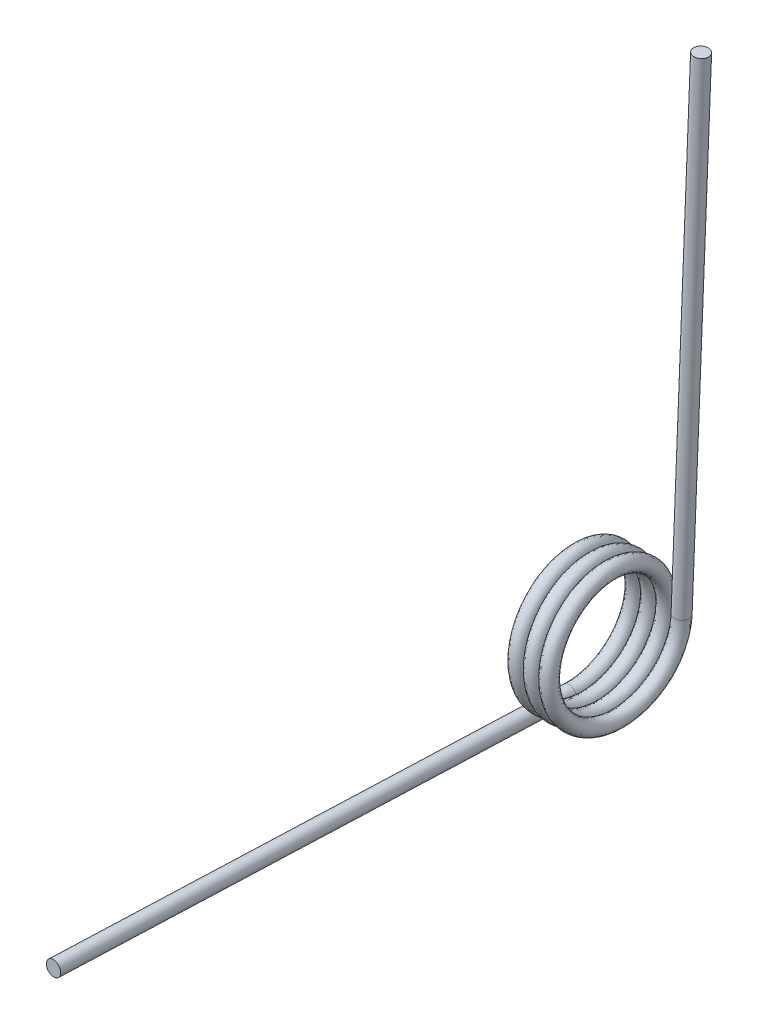
ISO-10303-21;
HEADER;
FILE_DESCRIPTION(('STEP AP214'),'2;1');
FILE_NAME('part.step','',(''),(''),'','','');
FILE_SCHEMA(('AUTOMOTIVE_DESIGN { 1 0 10303 214 1 1 1 1 }'));
ENDSEC;
DATA;
#1=APPLICATION_CONTEXT('core data for automotive mechanical design processes');
#2=APPLICATION_PROTOCOL_DEFINITION('international standard','automotive_design',2000,#1);
#3=PRODUCT_CONTEXT('',#1,'mechanical');
#4=PRODUCT('Part','Part','',(#3));
#5=PRODUCT_RELATED_PRODUCT_CATEGORY('part','',(#4));
#6=PRODUCT_DEFINITION_FORMATION('','',#4);
#7=PRODUCT_DEFINITION_CONTEXT('part definition',#1,'design');
#8=PRODUCT_DEFINITION('design','',#6,#7);
#9=PRODUCT_DEFINITION_SHAPE('','',#8);
#10=(LENGTH_UNIT() NAMED_UNIT(*) SI_UNIT(.MILLI.,.METRE.));
#11=(NAMED_UNIT(*) PLANE_ANGLE_UNIT() SI_UNIT($,.RADIAN.));
#12=(NAMED_UNIT(*) SI_UNIT($,.STERADIAN.) SOLID_ANGLE_UNIT());
#13=UNCERTAINTY_MEASURE_WITH_UNIT(LENGTH_MEASURE(1.E-05),#10,'distance_accuracy_value','');
#14=(GEOMETRIC_REPRESENTATION_CONTEXT(3) GLOBAL_UNCERTAINTY_ASSIGNED_CONTEXT((#13)) GLOBAL_UNIT_ASSIGNED_CONTEXT((#10,
#11,#12)) REPRESENTATION_CONTEXT('',''));
#15=CARTESIAN_POINT('',(0.,0.,0.));
#16=DIRECTION('',(0.,0.,1.));
#17=DIRECTION('',(1.,0.,0.));
#18=AXIS2_PLACEMENT_3D('',#15,#16,#17);
#19=CARTESIAN_POINT('',(-0.380705918215079,-3.1877,-0.0149667576988089));
#20=CARTESIAN_POINT('',(-0.315089251548412,-3.1790589384137,-1.85538621079458));
#21=CARTESIAN_POINT('',(-0.249472584881746,-1.58088840762055,-2.76811255849306));
#22=CARTESIAN_POINT('',(-0.183855918215079,0.0172821231726062,-3.68083890619154));
#23=CARTESIAN_POINT('',(-0.118239251548413,1.60681159237945,-2.75314580079425));
#24=CARTESIAN_POINT('',(-0.0526225848817462,3.1963410615863,-1.82545269539696));
#25=CARTESIAN_POINT('',(0.0129940817849203,3.1877,0.0149667576988085));
#26=CARTESIAN_POINT('',(0.0786107484515868,3.1790589384137,1.85538621079458));
#27=CARTESIAN_POINT('',(0.144227415118253,1.58088840762055,2.76811255849306));
#28=CARTESIAN_POINT('',(0.20984408178492,-0.0172821231726057,3.68083890619154));
#29=CARTESIAN_POINT('',(0.275460748451586,-1.60681159237945,2.75314580079425));
#30=CARTESIAN_POINT('',(0.341077415118253,-3.1963410615863,1.82545269539696));
#31=CARTESIAN_POINT('',(0.406694081784919,-3.1877,-0.0149667576988089));
#32=CARTESIAN_POINT('',(0.472310748451586,-3.1790589384137,-1.85538621079458));
#33=CARTESIAN_POINT('',(0.537927415118252,-1.58088840762055,-2.76811255849306));
#34=CARTESIAN_POINT('',(0.603544081784919,0.0172821231726062,-3.68083890619154));
#35=CARTESIAN_POINT('',(0.669160748451586,1.60681159237945,-2.75314580079425));
#36=CARTESIAN_POINT('',(0.734777415118252,3.1963410615863,-1.82545269539696));
#37=CARTESIAN_POINT('',(0.800394081784919,3.1877,0.0149667576988085));
#38=CARTESIAN_POINT('',(0.866010748451585,3.1790589384137,1.85538621079458));
#39=CARTESIAN_POINT('',(0.931627415118252,1.58088840762055,2.76811255849306));
#40=CARTESIAN_POINT('',(0.997244081784918,-0.0172821231726057,3.68083890619154));
#41=CARTESIAN_POINT('',(1.06286074845158,-1.60681159237945,2.75314580079425));
#42=CARTESIAN_POINT('',(1.12847741511825,-3.1963410615863,1.82545269539696));
#43=CARTESIAN_POINT('',(1.19409408178492,-3.1877,-0.0149667576988089));
#44=CARTESIAN_POINT('',(1.25971074845158,-3.1790589384137,-1.85538621079458));
#45=CARTESIAN_POINT('',(1.32532741511825,-1.58088840762055,-2.76811255849306));
#46=CARTESIAN_POINT('',(1.39094408178492,0.0172821231726062,-3.68083890619154));
#47=CARTESIAN_POINT('',(1.45656074845158,1.60681159237945,-2.75314580079425));
#48=CARTESIAN_POINT('',(1.52217741511825,3.1963410615863,-1.82545269539696));
#49=CARTESIAN_POINT('',(1.58779408178492,3.1877,0.0149667576988085));
#50=CARTESIAN_POINT('',(1.65341074845158,3.1790589384137,1.85538621079458));
#51=CARTESIAN_POINT('',(1.71902741511825,1.58088840762055,2.76811255849306));
#52=CARTESIAN_POINT('',(1.78464408178492,-0.0172821231726057,3.68083890619154));
#53=CARTESIAN_POINT('',(1.85026074845158,-1.60681159237945,2.75314580079425));
#54=CARTESIAN_POINT('',(1.91587741511825,-3.1963410615863,1.82545269539696));
#55=CARTESIAN_POINT('',(1.98149408178492,-3.1877,-0.0149667576988089));
#56=CARTESIAN_POINT('',(2.04711074845158,-3.1790589384137,-1.85538621079458));
#57=CARTESIAN_POINT('',(2.11272741511825,-1.58088840762055,-2.76811255849306));
#58=CARTESIAN_POINT('',(2.17834408178492,0.0172821231726062,-3.68083890619154));
#59=CARTESIAN_POINT('',(2.24396074845158,1.60681159237945,-2.75314580079425));
#60=CARTESIAN_POINT('',(2.30957741511825,3.1963410615863,-1.82545269539696));
#61=CARTESIAN_POINT('',(2.37519408178491,3.1877,0.0149667576988085));
#62=CARTESIAN_POINT('',(2.44081074845158,3.1790589384137,1.85538621079458));
#63=CARTESIAN_POINT('',(2.50642741511825,1.58088840762055,2.76811255849306));
#64=CARTESIAN_POINT('',(2.57204408178491,-0.0172821231726057,3.68083890619154));
#65=CARTESIAN_POINT('',(2.63766074845158,-1.60681159237945,2.75314580079425));
#66=CARTESIAN_POINT('',(2.70327741511825,-3.1963410615863,1.82545269539696));
#67=CARTESIAN_POINT('',(2.76889408178491,-3.1877,-0.0149667576988089));
#68=CARTESIAN_POINT('',(-0.380705918215079,-2.4257,-0.0149667576988011));
#69=CARTESIAN_POINT('',(-0.315089251548413,-2.4170589384137,-1.41544530567208));
#70=CARTESIAN_POINT('',(-0.249472584881746,-1.19988840762055,-2.10820120080931));
#71=CARTESIAN_POINT('',(-0.18385591821508,0.0172821231725972,-2.80095709594655));
#72=CARTESIAN_POINT('',(-0.118239251548413,1.22581159237945,-2.09323444311051));
#73=CARTESIAN_POINT('',(-0.0526225848817465,2.4343410615863,-1.38551179027448));
#74=CARTESIAN_POINT('',(0.01299408178492,2.4257,0.0149667576988008));
#75=CARTESIAN_POINT('',(0.0786107484515865,2.4170589384137,1.41544530567208));
#76=CARTESIAN_POINT('',(0.144227415118253,1.19988840762055,2.10820120080931));
#77=CARTESIAN_POINT('',(0.20984408178492,-0.0172821231725969,2.80095709594655));
#78=CARTESIAN_POINT('',(0.275460748451586,-1.22581159237945,2.09323444311051));
#79=CARTESIAN_POINT('',(0.341077415118253,-2.4343410615863,1.38551179027448));
#80=CARTESIAN_POINT('',(0.406694081784919,-2.4257,-0.0149667576988011));
#81=CARTESIAN_POINT('',(0.472310748451586,-2.4170589384137,-1.41544530567208));
#82=CARTESIAN_POINT('',(0.537927415118252,-1.19988840762055,-2.10820120080931));
#83=CARTESIAN_POINT('',(0.603544081784919,0.0172821231725972,-2.80095709594655));
#84=CARTESIAN_POINT('',(0.669160748451585,1.22581159237945,-2.09323444311051));
#85=CARTESIAN_POINT('',(0.734777415118252,2.4343410615863,-1.38551179027448));
#86=CARTESIAN_POINT('',(0.800394081784918,2.4257,0.0149667576988008));
#87=CARTESIAN_POINT('',(0.866010748451585,2.4170589384137,1.41544530567208));
#88=CARTESIAN_POINT('',(0.931627415118251,1.19988840762055,2.10820120080931));
#89=CARTESIAN_POINT('',(0.997244081784918,-0.0172821231725969,2.80095709594655));
#90=CARTESIAN_POINT('',(1.06286074845158,-1.22581159237945,2.09323444311051));
#91=CARTESIAN_POINT('',(1.12847741511825,-2.4343410615863,1.38551179027448));
#92=CARTESIAN_POINT('',(1.19409408178492,-2.4257,-0.0149667576988011));
#93=CARTESIAN_POINT('',(1.25971074845158,-2.4170589384137,-1.41544530567208));
#94=CARTESIAN_POINT('',(1.32532741511825,-1.19988840762055,-2.10820120080931));
#95=CARTESIAN_POINT('',(1.39094408178492,0.0172821231725972,-2.80095709594655));
#96=CARTESIAN_POINT('',(1.45656074845158,1.22581159237945,-2.09323444311051));
#97=CARTESIAN_POINT('',(1.52217741511825,2.4343410615863,-1.38551179027448));
#98=CARTESIAN_POINT('',(1.58779408178492,2.4257,0.0149667576988008));
#99=CARTESIAN_POINT('',(1.65341074845158,2.4170589384137,1.41544530567208));
#100=CARTESIAN_POINT('',(1.71902741511825,1.19988840762055,2.10820120080931));
#101=CARTESIAN_POINT('',(1.78464408178492,-0.0172821231725969,2.80095709594655));
#102=CARTESIAN_POINT('',(1.85026074845158,-1.22581159237945,2.09323444311051));
#103=CARTESIAN_POINT('',(1.91587741511825,-2.4343410615863,1.38551179027448));
#104=CARTESIAN_POINT('',(1.98149408178492,-2.4257,-0.0149667576988011));
#105=CARTESIAN_POINT('',(2.04711074845158,-2.4170589384137,-1.41544530567208));
#106=CARTESIAN_POINT('',(2.11272741511825,-1.19988840762055,-2.10820120080931));
#107=CARTESIAN_POINT('',(2.17834408178492,0.0172821231725972,-2.80095709594655));
#108=CARTESIAN_POINT('',(2.24396074845158,1.22581159237945,-2.09323444311051));
#109=CARTESIAN_POINT('',(2.30957741511825,2.4343410615863,-1.38551179027448));
#110=CARTESIAN_POINT('',(2.37519408178491,2.4257,0.0149667576988008));
#111=CARTESIAN_POINT('',(2.44081074845158,2.4170589384137,1.41544530567208));
#112=CARTESIAN_POINT('',(2.50642741511825,1.19988840762055,2.10820120080931));
#113=CARTESIAN_POINT('',(2.57204408178491,-0.0172821231725969,2.80095709594655));
#114=CARTESIAN_POINT('',(2.63766074845158,-1.22581159237945,2.09323444311051));
#115=CARTESIAN_POINT('',(2.70327741511825,-2.4343410615863,1.38551179027448));
#116=CARTESIAN_POINT('',(2.76889408178491,-2.4257,-0.0149667576988011));
#117=CARTESIAN_POINT('',(0.380705918215078,-2.4257,0.0149667576987499));
#118=CARTESIAN_POINT('',(0.446322584881745,-2.43434106158627,-1.38551179027453));
#119=CARTESIAN_POINT('',(0.511939251548411,-1.2258115923794,-2.09323444311054));
#120=CARTESIAN_POINT('',(0.577555918215078,-0.0172821231725385,-2.80095709594655));
#121=CARTESIAN_POINT('',(0.643172584881745,1.1998884076206,-2.10820120080929));
#122=CARTESIAN_POINT('',(0.708789251548411,2.41705893841373,-1.41544530567203));
#123=CARTESIAN_POINT('',(0.774405918215077,2.4257,-0.0149667576987502));
#124=CARTESIAN_POINT('',(0.840022584881744,2.43434106158627,1.38551179027453));
#125=CARTESIAN_POINT('',(0.905639251548411,1.22581159237941,2.09323444311054));
#126=CARTESIAN_POINT('',(0.971255918215077,0.0172821231725388,2.80095709594655));
#127=CARTESIAN_POINT('',(1.03687258488174,-1.1998884076206,2.10820120080929));
#128=CARTESIAN_POINT('',(1.10248925154841,-2.41705893841373,1.41544530567203));
#129=CARTESIAN_POINT('',(1.16810591821508,-2.4257,0.0149667576987499));
#130=CARTESIAN_POINT('',(1.23372258488174,-2.43434106158627,-1.38551179027453));
#131=CARTESIAN_POINT('',(1.29933925154841,-1.2258115923794,-2.09323444311054));
#132=CARTESIAN_POINT('',(1.36495591821508,-0.0172821231725385,-2.80095709594655));
#133=CARTESIAN_POINT('',(1.43057258488174,1.1998884076206,-2.10820120080929));
#134=CARTESIAN_POINT('',(1.49618925154841,2.41705893841373,-1.41544530567203));
#135=CARTESIAN_POINT('',(1.56180591821508,2.4257,-0.0149667576987502));
#136=CARTESIAN_POINT('',(1.62742258488174,2.43434106158627,1.38551179027453));
#137=CARTESIAN_POINT('',(1.69303925154841,1.22581159237941,2.09323444311054));
#138=CARTESIAN_POINT('',(1.75865591821508,0.0172821231725388,2.80095709594655));
#139=CARTESIAN_POINT('',(1.82427258488174,-1.1998884076206,2.10820120080929));
#140=CARTESIAN_POINT('',(1.88988925154841,-2.41705893841373,1.41544530567203));
#141=CARTESIAN_POINT('',(1.95550591821507,-2.4257,0.0149667576987499));
#142=CARTESIAN_POINT('',(2.02112258488174,-2.43434106158627,-1.38551179027453));
#143=CARTESIAN_POINT('',(2.08673925154841,-1.2258115923794,-2.09323444311054));
#144=CARTESIAN_POINT('',(2.15235591821507,-0.0172821231725385,-2.80095709594655));
#145=CARTESIAN_POINT('',(2.21797258488174,1.1998884076206,-2.10820120080929));
#146=CARTESIAN_POINT('',(2.28358925154841,2.41705893841373,-1.41544530567203));
#147=CARTESIAN_POINT('',(2.34920591821507,2.4257,-0.0149667576987502));
#148=CARTESIAN_POINT('',(2.41482258488174,2.43434106158627,1.38551179027453));
#149=CARTESIAN_POINT('',(2.48043925154841,1.22581159237941,2.09323444311054));
#150=CARTESIAN_POINT('',(2.54605591821507,0.0172821231725388,2.80095709594655));
#151=CARTESIAN_POINT('',(2.61167258488174,-1.1998884076206,2.10820120080929));
#152=CARTESIAN_POINT('',(2.67728925154841,-2.41705893841373,1.41544530567203));
#153=CARTESIAN_POINT('',(2.74290591821507,-2.4257,0.0149667576987499));
#154=CARTESIAN_POINT('',(2.80852258488174,-2.43434106158627,-1.38551179027453));
#155=CARTESIAN_POINT('',(2.87413925154841,-1.2258115923794,-2.09323444311054));
#156=CARTESIAN_POINT('',(2.93975591821507,-0.0172821231725385,-2.80095709594655));
#157=CARTESIAN_POINT('',(3.00537258488174,1.1998884076206,-2.10820120080929));
#158=CARTESIAN_POINT('',(3.07098925154841,2.41705893841373,-1.41544530567203));
#159=CARTESIAN_POINT('',(3.13660591821507,2.4257,-0.0149667576987502));
#160=CARTESIAN_POINT('',(3.20222258488174,2.43434106158627,1.38551179027453));
#161=CARTESIAN_POINT('',(3.26783925154841,1.22581159237941,2.09323444311054));
#162=CARTESIAN_POINT('',(3.33345591821507,0.0172821231725388,2.80095709594655));
#163=CARTESIAN_POINT('',(3.39907258488174,-1.1998884076206,2.10820120080929));
#164=CARTESIAN_POINT('',(3.46468925154841,-2.41705893841373,1.41544530567203));
#165=CARTESIAN_POINT('',(3.53030591821507,-2.4257,0.0149667576987499));
#166=CARTESIAN_POINT('',(0.380705918215079,-3.1877,0.0149667576987421));
#167=CARTESIAN_POINT('',(0.446322584881745,-3.19634106158626,-1.82545269539703));
#168=CARTESIAN_POINT('',(0.511939251548412,-1.6068115923794,-2.75314580079428));
#169=CARTESIAN_POINT('',(0.577555918215078,-0.0172821231725295,-3.68083890619154));
#170=CARTESIAN_POINT('',(0.643172584881745,1.5808884076206,-2.76811255849303));
#171=CARTESIAN_POINT('',(0.708789251548412,3.17905893841374,-1.85538621079451));
#172=CARTESIAN_POINT('',(0.774405918215078,3.1877,-0.0149667576987425));
#173=CARTESIAN_POINT('',(0.840022584881744,3.19634106158626,1.82545269539703));
#174=CARTESIAN_POINT('',(0.905639251548411,1.6068115923794,2.75314580079428));
#175=CARTESIAN_POINT('',(0.971255918215078,0.01728212317253,3.68083890619154));
#176=CARTESIAN_POINT('',(1.03687258488174,-1.5808884076206,2.76811255849303));
#177=CARTESIAN_POINT('',(1.10248925154841,-3.17905893841374,1.85538621079451));
#178=CARTESIAN_POINT('',(1.16810591821508,-3.1877,0.0149667576987421));
#179=CARTESIAN_POINT('',(1.23372258488174,-3.19634106158626,-1.82545269539703));
#180=CARTESIAN_POINT('',(1.29933925154841,-1.6068115923794,-2.75314580079428));
#181=CARTESIAN_POINT('',(1.36495591821508,-0.0172821231725295,-3.68083890619154));
#182=CARTESIAN_POINT('',(1.43057258488174,1.5808884076206,-2.76811255849303));
#183=CARTESIAN_POINT('',(1.49618925154841,3.17905893841374,-1.85538621079451));
#184=CARTESIAN_POINT('',(1.56180591821508,3.1877,-0.0149667576987425));
#185=CARTESIAN_POINT('',(1.62742258488174,3.19634106158626,1.82545269539703));
#186=CARTESIAN_POINT('',(1.69303925154841,1.6068115923794,2.75314580079428));
#187=CARTESIAN_POINT('',(1.75865591821508,0.01728212317253,3.68083890619154));
#188=CARTESIAN_POINT('',(1.82427258488174,-1.5808884076206,2.76811255849303));
#189=CARTESIAN_POINT('',(1.88988925154841,-3.17905893841374,1.85538621079451));
#190=CARTESIAN_POINT('',(1.95550591821508,-3.1877,0.0149667576987421));
#191=CARTESIAN_POINT('',(2.02112258488174,-3.19634106158626,-1.82545269539703));
#192=CARTESIAN_POINT('',(2.08673925154841,-1.6068115923794,-2.75314580079428));
#193=CARTESIAN_POINT('',(2.15235591821508,-0.0172821231725295,-3.68083890619154));
#194=CARTESIAN_POINT('',(2.21797258488174,1.5808884076206,-2.76811255849303));
#195=CARTESIAN_POINT('',(2.28358925154841,3.17905893841374,-1.85538621079451));
#196=CARTESIAN_POINT('',(2.34920591821507,3.1877,-0.0149667576987425));
#197=CARTESIAN_POINT('',(2.41482258488174,3.19634106158626,1.82545269539703));
#198=CARTESIAN_POINT('',(2.48043925154841,1.6068115923794,2.75314580079428));
#199=CARTESIAN_POINT('',(2.54605591821507,0.01728212317253,3.68083890619154));
#200=CARTESIAN_POINT('',(2.61167258488174,-1.5808884076206,2.76811255849303));
#201=CARTESIAN_POINT('',(2.67728925154841,-3.17905893841374,1.85538621079451));
#202=CARTESIAN_POINT('',(2.74290591821507,-3.1877,0.0149667576987421));
#203=CARTESIAN_POINT('',(2.80852258488174,-3.19634106158626,-1.82545269539703));
#204=CARTESIAN_POINT('',(2.87413925154841,-1.6068115923794,-2.75314580079428));
#205=CARTESIAN_POINT('',(2.93975591821507,-0.0172821231725295,-3.68083890619154));
#206=CARTESIAN_POINT('',(3.00537258488174,1.5808884076206,-2.76811255849303));
#207=CARTESIAN_POINT('',(3.07098925154841,3.17905893841374,-1.85538621079451));
#208=CARTESIAN_POINT('',(3.13660591821507,3.1877,-0.0149667576987425));
#209=CARTESIAN_POINT('',(3.20222258488174,3.19634106158626,1.82545269539703));
#210=CARTESIAN_POINT('',(3.26783925154841,1.6068115923794,2.75314580079428));
#211=CARTESIAN_POINT('',(3.33345591821507,0.01728212317253,3.68083890619154));
#212=CARTESIAN_POINT('',(3.39907258488174,-1.5808884076206,2.76811255849303));
#213=CARTESIAN_POINT('',(3.46468925154841,-3.17905893841374,1.85538621079451));
#214=CARTESIAN_POINT('',(3.53030591821507,-3.1877,0.0149667576987421));
#215=CARTESIAN_POINT('',(0.380705918215079,-3.9497,0.0149667576987343));
#216=CARTESIAN_POINT('',(0.446322584881746,-3.95834106158626,-2.26539360051953));
#217=CARTESIAN_POINT('',(0.511939251548412,-1.98781159237939,-3.41305715847803));
#218=CARTESIAN_POINT('',(0.577555918215079,-0.0172821231725206,-4.56072071643653));
#219=CARTESIAN_POINT('',(0.643172584881745,1.96188840762061,-3.42802391617677));
#220=CARTESIAN_POINT('',(0.708789251548412,3.94105893841374,-2.295327115917));
#221=CARTESIAN_POINT('',(0.774405918215078,3.9497,-0.0149667576987348));
#222=CARTESIAN_POINT('',(0.840022584881745,3.95834106158626,2.26539360051953));
#223=CARTESIAN_POINT('',(0.905639251548411,1.98781159237939,3.41305715847803));
#224=CARTESIAN_POINT('',(0.971255918215078,0.0172821231725211,4.56072071643653));
#225=CARTESIAN_POINT('',(1.03687258488174,-1.96188840762061,3.42802391617677));
#226=CARTESIAN_POINT('',(1.10248925154841,-3.94105893841374,2.295327115917));
#227=CARTESIAN_POINT('',(1.16810591821508,-3.9497,0.0149667576987343));
#228=CARTESIAN_POINT('',(1.23372258488174,-3.95834106158626,-2.26539360051953));
#229=CARTESIAN_POINT('',(1.29933925154841,-1.98781159237939,-3.41305715847803));
#230=CARTESIAN_POINT('',(1.36495591821508,-0.0172821231725206,-4.56072071643653));
#231=CARTESIAN_POINT('',(1.43057258488174,1.96188840762061,-3.42802391617677));
#232=CARTESIAN_POINT('',(1.49618925154841,3.94105893841374,-2.295327115917));
#233=CARTESIAN_POINT('',(1.56180591821508,3.9497,-0.0149667576987348));
#234=CARTESIAN_POINT('',(1.62742258488174,3.95834106158626,2.26539360051953));
#235=CARTESIAN_POINT('',(1.69303925154841,1.98781159237939,3.41305715847803));
#236=CARTESIAN_POINT('',(1.75865591821508,0.0172821231725211,4.56072071643653));
#237=CARTESIAN_POINT('',(1.82427258488174,-1.96188840762061,3.42802391617677));
#238=CARTESIAN_POINT('',(1.88988925154841,-3.94105893841374,2.295327115917));
#239=CARTESIAN_POINT('',(1.95550591821508,-3.9497,0.0149667576987343));
#240=CARTESIAN_POINT('',(2.02112258488174,-3.95834106158626,-2.26539360051953));
#241=CARTESIAN_POINT('',(2.08673925154841,-1.98781159237939,-3.41305715847803));
#242=CARTESIAN_POINT('',(2.15235591821508,-0.0172821231725206,-4.56072071643653));
#243=CARTESIAN_POINT('',(2.21797258488174,1.96188840762061,-3.42802391617677));
#244=CARTESIAN_POINT('',(2.28358925154841,3.94105893841374,-2.295327115917));
#245=CARTESIAN_POINT('',(2.34920591821508,3.9497,-0.0149667576987348));
#246=CARTESIAN_POINT('',(2.41482258488174,3.95834106158626,2.26539360051953));
#247=CARTESIAN_POINT('',(2.48043925154841,1.98781159237939,3.41305715847803));
#248=CARTESIAN_POINT('',(2.54605591821508,0.0172821231725211,4.56072071643653));
#249=CARTESIAN_POINT('',(2.61167258488174,-1.96188840762061,3.42802391617677));
#250=CARTESIAN_POINT('',(2.67728925154841,-3.94105893841374,2.295327115917));
#251=CARTESIAN_POINT('',(2.74290591821507,-3.9497,0.0149667576987343));
#252=CARTESIAN_POINT('',(2.80852258488174,-3.95834106158626,-2.26539360051953));
#253=CARTESIAN_POINT('',(2.87413925154841,-1.98781159237939,-3.41305715847803));
#254=CARTESIAN_POINT('',(2.93975591821507,-0.0172821231725206,-4.56072071643653));
#255=CARTESIAN_POINT('',(3.00537258488174,1.96188840762061,-3.42802391617677));
#256=CARTESIAN_POINT('',(3.07098925154841,3.94105893841374,-2.295327115917));
#257=CARTESIAN_POINT('',(3.13660591821507,3.9497,-0.0149667576987348));
#258=CARTESIAN_POINT('',(3.20222258488174,3.95834106158626,2.26539360051953));
#259=CARTESIAN_POINT('',(3.26783925154841,1.98781159237939,3.41305715847803));
#260=CARTESIAN_POINT('',(3.33345591821507,0.0172821231725211,4.56072071643653));
#261=CARTESIAN_POINT('',(3.39907258488174,-1.96188840762061,3.42802391617677));
#262=CARTESIAN_POINT('',(3.46468925154841,-3.94105893841374,2.295327115917));
#263=CARTESIAN_POINT('',(3.53030591821507,-3.9497,0.0149667576987343));
#264=CARTESIAN_POINT('',(-0.380705918215079,-3.9497,-0.0149667576988167));
#265=CARTESIAN_POINT('',(-0.315089251548412,-3.94105893841369,-2.29532711591708));
#266=CARTESIAN_POINT('',(-0.249472584881745,-1.96188840762054,-3.42802391617681));
#267=CARTESIAN_POINT('',(-0.183855918215079,0.0172821231726151,-4.56072071643653));
#268=CARTESIAN_POINT('',(-0.118239251548412,1.98781159237946,-3.41305715847799));
#269=CARTESIAN_POINT('',(-0.0526225848817458,3.95834106158631,-2.26539360051945));
#270=CARTESIAN_POINT('',(0.0129940817849206,3.9497,0.0149667576988162));
#271=CARTESIAN_POINT('',(0.0786107484515872,3.94105893841369,2.29532711591708));
#272=CARTESIAN_POINT('',(0.144227415118254,1.96188840762054,3.42802391617681));
#273=CARTESIAN_POINT('',(0.20984408178492,-0.0172821231726146,4.56072071643653));
#274=CARTESIAN_POINT('',(0.275460748451587,-1.98781159237946,3.41305715847799));
#275=CARTESIAN_POINT('',(0.341077415118253,-3.95834106158631,2.26539360051945));
#276=CARTESIAN_POINT('',(0.40669408178492,-3.9497,-0.0149667576988167));
#277=CARTESIAN_POINT('',(0.472310748451586,-3.94105893841369,-2.29532711591708));
#278=CARTESIAN_POINT('',(0.537927415118253,-1.96188840762054,-3.42802391617681));
#279=CARTESIAN_POINT('',(0.603544081784919,0.0172821231726151,-4.56072071643653));
#280=CARTESIAN_POINT('',(0.669160748451586,1.98781159237946,-3.41305715847799));
#281=CARTESIAN_POINT('',(0.734777415118252,3.95834106158631,-2.26539360051945));
#282=CARTESIAN_POINT('',(0.800394081784919,3.9497,0.0149667576988162));
#283=CARTESIAN_POINT('',(0.866010748451585,3.94105893841369,2.29532711591708));
#284=CARTESIAN_POINT('',(0.931627415118252,1.96188840762054,3.42802391617681));
#285=CARTESIAN_POINT('',(0.997244081784919,-0.0172821231726146,4.56072071643653));
#286=CARTESIAN_POINT('',(1.06286074845159,-1.98781159237946,3.41305715847799));
#287=CARTESIAN_POINT('',(1.12847741511825,-3.95834106158631,2.26539360051945));
#288=CARTESIAN_POINT('',(1.19409408178492,-3.9497,-0.0149667576988167));
#289=CARTESIAN_POINT('',(1.25971074845158,-3.94105893841369,-2.29532711591708));
#290=CARTESIAN_POINT('',(1.32532741511825,-1.96188840762054,-3.42802391617681));
#291=CARTESIAN_POINT('',(1.39094408178492,0.0172821231726151,-4.56072071643653));
#292=CARTESIAN_POINT('',(1.45656074845158,1.98781159237946,-3.41305715847799));
#293=CARTESIAN_POINT('',(1.52217741511825,3.95834106158631,-2.26539360051945));
#294=CARTESIAN_POINT('',(1.58779408178492,3.9497,0.0149667576988162));
#295=CARTESIAN_POINT('',(1.65341074845158,3.94105893841369,2.29532711591708));
#296=CARTESIAN_POINT('',(1.71902741511825,1.96188840762054,3.42802391617681));
#297=CARTESIAN_POINT('',(1.78464408178492,-0.0172821231726146,4.56072071643653));
#298=CARTESIAN_POINT('',(1.85026074845158,-1.98781159237946,3.41305715847799));
#299=CARTESIAN_POINT('',(1.91587741511825,-3.95834106158631,2.26539360051945));
#300=CARTESIAN_POINT('',(1.98149408178492,-3.9497,-0.0149667576988167));
#301=CARTESIAN_POINT('',(2.04711074845158,-3.94105893841369,-2.29532711591708));
#302=CARTESIAN_POINT('',(2.11272741511825,-1.96188840762054,-3.42802391617681));
#303=CARTESIAN_POINT('',(2.17834408178492,0.0172821231726151,-4.56072071643653));
#304=CARTESIAN_POINT('',(2.24396074845158,1.98781159237946,-3.41305715847799));
#305=CARTESIAN_POINT('',(2.30957741511825,3.95834106158631,-2.26539360051945));
#306=CARTESIAN_POINT('',(2.37519408178492,3.9497,0.0149667576988162));
#307=CARTESIAN_POINT('',(2.44081074845158,3.94105893841369,2.29532711591708));
#308=CARTESIAN_POINT('',(2.50642741511825,1.96188840762054,3.42802391617681));
#309=CARTESIAN_POINT('',(2.57204408178492,-0.0172821231726146,4.56072071643653));
#310=CARTESIAN_POINT('',(2.63766074845158,-1.98781159237946,3.41305715847799));
#311=CARTESIAN_POINT('',(2.70327741511825,-3.95834106158631,2.26539360051945));
#312=CARTESIAN_POINT('',(2.76889408178491,-3.9497,-0.0149667576988167));
#313=CARTESIAN_POINT('',(-0.380705918215079,-3.1877,-0.0149667576988089));
#314=CARTESIAN_POINT('',(-0.315089251548412,-3.1790589384137,-1.85538621079458));
#315=CARTESIAN_POINT('',(-0.249472584881746,-1.58088840762055,-2.76811255849306));
#316=CARTESIAN_POINT('',(-0.183855918215079,0.0172821231726062,-3.68083890619154));
#317=CARTESIAN_POINT('',(-0.118239251548413,1.60681159237945,-2.75314580079425));
#318=CARTESIAN_POINT('',(-0.0526225848817462,3.1963410615863,-1.82545269539696));
#319=CARTESIAN_POINT('',(0.0129940817849203,3.1877,0.0149667576988085));
#320=CARTESIAN_POINT('',(0.0786107484515868,3.1790589384137,1.85538621079458));
#321=CARTESIAN_POINT('',(0.144227415118253,1.58088840762055,2.76811255849306));
#322=CARTESIAN_POINT('',(0.20984408178492,-0.0172821231726057,3.68083890619154));
#323=CARTESIAN_POINT('',(0.275460748451586,-1.60681159237945,2.75314580079425));
#324=CARTESIAN_POINT('',(0.341077415118253,-3.1963410615863,1.82545269539696));
#325=CARTESIAN_POINT('',(0.406694081784919,-3.1877,-0.0149667576988089));
#326=CARTESIAN_POINT('',(0.472310748451586,-3.1790589384137,-1.85538621079458));
#327=CARTESIAN_POINT('',(0.537927415118252,-1.58088840762055,-2.76811255849306));
#328=CARTESIAN_POINT('',(0.603544081784919,0.0172821231726062,-3.68083890619154));
#329=CARTESIAN_POINT('',(0.669160748451586,1.60681159237945,-2.75314580079425));
#330=CARTESIAN_POINT('',(0.734777415118252,3.1963410615863,-1.82545269539696));
#331=CARTESIAN_POINT('',(0.800394081784919,3.1877,0.0149667576988085));
#332=CARTESIAN_POINT('',(0.866010748451585,3.1790589384137,1.85538621079458));
#333=CARTESIAN_POINT('',(0.931627415118252,1.58088840762055,2.76811255849306));
#334=CARTESIAN_POINT('',(0.997244081784918,-0.0172821231726057,3.68083890619154));
#335=CARTESIAN_POINT('',(1.06286074845158,-1.60681159237945,2.75314580079425));
#336=CARTESIAN_POINT('',(1.12847741511825,-3.1963410615863,1.82545269539696));
#337=CARTESIAN_POINT('',(1.19409408178492,-3.1877,-0.0149667576988089));
#338=CARTESIAN_POINT('',(1.25971074845158,-3.1790589384137,-1.85538621079458));
#339=CARTESIAN_POINT('',(1.32532741511825,-1.58088840762055,-2.76811255849306));
#340=CARTESIAN_POINT('',(1.39094408178492,0.0172821231726062,-3.68083890619154));
#341=CARTESIAN_POINT('',(1.45656074845158,1.60681159237945,-2.75314580079425));
#342=CARTESIAN_POINT('',(1.52217741511825,3.1963410615863,-1.82545269539696));
#343=CARTESIAN_POINT('',(1.58779408178492,3.1877,0.0149667576988085));
#344=CARTESIAN_POINT('',(1.65341074845158,3.1790589384137,1.85538621079458));
#345=CARTESIAN_POINT('',(1.71902741511825,1.58088840762055,2.76811255849306));
#346=CARTESIAN_POINT('',(1.78464408178492,-0.0172821231726057,3.68083890619154));
#347=CARTESIAN_POINT('',(1.85026074845158,-1.60681159237945,2.75314580079425));
#348=CARTESIAN_POINT('',(1.91587741511825,-3.1963410615863,1.82545269539696));
#349=CARTESIAN_POINT('',(1.98149408178492,-3.1877,-0.0149667576988089));
#350=CARTESIAN_POINT('',(2.04711074845158,-3.1790589384137,-1.85538621079458));
#351=CARTESIAN_POINT('',(2.11272741511825,-1.58088840762055,-2.76811255849306));
#352=CARTESIAN_POINT('',(2.17834408178492,0.0172821231726062,-3.68083890619154));
#353=CARTESIAN_POINT('',(2.24396074845158,1.60681159237945,-2.75314580079425));
#354=CARTESIAN_POINT('',(2.30957741511825,3.1963410615863,-1.82545269539696));
#355=CARTESIAN_POINT('',(2.37519408178491,3.1877,0.0149667576988085));
#356=CARTESIAN_POINT('',(2.44081074845158,3.1790589384137,1.85538621079458));
#357=CARTESIAN_POINT('',(2.50642741511825,1.58088840762055,2.76811255849306));
#358=CARTESIAN_POINT('',(2.57204408178491,-0.0172821231726057,3.68083890619154));
#359=CARTESIAN_POINT('',(2.63766074845158,-1.60681159237945,2.75314580079425));
#360=CARTESIAN_POINT('',(2.70327741511825,-3.1963410615863,1.82545269539696));
#361=CARTESIAN_POINT('',(2.76889408178491,-3.1877,-0.0149667576988089));
#362=(BOUNDED_SURFACE() B_SPLINE_SURFACE(3,2,((#19,#20,#21,#22,#23,#24,#25,#26,#27,#28,#29,#30,
#31,#32,#33,#34,#35,#36,#37,#38,#39,#40,#41,#42,#43,#44,#45,#46,#47,#48,#49,#50,#51,#52,#53,#54,
#55,#56,#57,#58,#59,#60,#61,#62,#63,#64,#65,#66,#67),(#68,#69,#70,#71,#72,#73,#74,#75,#76,#77,
#78,#79,#80,#81,#82,#83,#84,#85,#86,#87,#88,#89,#90,#91,#92,#93,#94,#95,#96,#97,#98,#99,#100,
#101,#102,#103,#104,#105,#106,#107,#108,#109,#110,#111,#112,#113,#114,#115,#116),(#117,#118,
#119,#120,#121,#122,#123,#124,#125,#126,#127,#128,#129,#130,#131,#132,#133,#134,#135,#136,#137,
#138,#139,#140,#141,#142,#143,#144,#145,#146,#147,#148,#149,#150,#151,#152,#153,#154,#155,#156,
#157,#158,#159,#160,#161,#162,#163,#164,#165),(#166,#167,#168,#169,#170,#171,#172,#173,#174,
#175,#176,#177,#178,#179,#180,#181,#182,#183,#184,#185,#186,#187,#188,#189,#190,#191,#192,#193,
#194,#195,#196,#197,#198,#199,#200,#201,#202,#203,#204,#205,#206,#207,#208,#209,#210,#211,#212,
#213,#214),(#215,#216,#217,#218,#219,#220,#221,#222,#223,#224,#225,#226,#227,#228,#229,#230,
#231,#232,#233,#234,#235,#236,#237,#238,#239,#240,#241,#242,#243,#244,#245,#246,#247,#248,#249,
#250,#251,#252,#253,#254,#255,#256,#257,#258,#259,#260,#261,#262,#263),(#264,#265,#266,#267,
#268,#269,#270,#271,#272,#273,#274,#275,#276,#277,#278,#279,#280,#281,#282,#283,#284,#285,#286,
#287,#288,#289,#290,#291,#292,#293,#294,#295,#296,#297,#298,#299,#300,#301,#302,#303,#304,#305,
#306,#307,#308,#309,#310,#311,#312),(#313,#314,#315,#316,#317,#318,#319,#320,#321,#322,#323,
#324,#325,#326,#327,#328,#329,#330,#331,#332,#333,#334,#335,#336,#337,#338,#339,#340,#341,#342,
#343,#344,#345,#346,#347,#348,#349,#350,#351,#352,#353,#354,#355,#356,#357,#358,#359,#360,
#361)),.UNSPECIFIED.,.T.,.F.,.F.) B_SPLINE_SURFACE_WITH_KNOTS((4,3,4),(3,2,2,2,2,2,2,2,2,2,2,2,
2,2,2,2,2,2,2,2,2,2,2,2,3),(0.,0.5,1.),(0.,0.0416666666666667,0.0833333333333333,0.125,
0.166666666666667,0.208333333333333,0.25,0.291666666666667,0.333333333333333,0.375,
0.416666666666667,0.458333333333333,0.5,0.541666666666667,0.583333333333333,0.625,
0.666666666666667,0.708333333333333,0.75,0.791666666666667,0.833333333333333,0.875,
0.916666666666667,0.958333333333333,1.),
.UNSPECIFIED.) GEOMETRIC_REPRESENTATION_ITEM() RATIONAL_B_SPLINE_SURFACE(((1.,0.866025403784439,
1.,0.866025403784439,1.,0.866025403784439,1.,0.866025403784439,1.,0.866025403784439,1.,
0.866025403784439,1.,0.866025403784439,1.,0.866025403784439,1.,0.866025403784439,1.,
0.866025403784439,1.,0.866025403784439,1.,0.866025403784439,1.,0.866025403784439,1.,
0.866025403784439,1.,0.866025403784439,1.,0.866025403784439,1.,0.866025403784439,1.,
0.866025403784439,1.,0.866025403784439,1.,0.866025403784439,1.,0.866025403784439,1.,
0.866025403784439,1.,0.866025403784439,1.,0.866025403784439,1.),(0.333333333333333,
0.288675134594813,0.333333333333333,0.288675134594813,0.333333333333333,0.288675134594813,
0.333333333333333,0.288675134594813,0.333333333333333,0.288675134594813,0.333333333333333,
0.288675134594813,0.333333333333333,0.288675134594813,0.333333333333333,0.288675134594813,
0.333333333333333,0.288675134594813,0.333333333333333,0.288675134594813,0.333333333333333,
0.288675134594813,0.333333333333333,0.288675134594813,0.333333333333333,0.288675134594813,
0.333333333333333,0.288675134594813,0.333333333333333,0.288675134594813,0.333333333333333,
0.288675134594813,0.333333333333333,0.288675134594813,0.333333333333333,0.288675134594813,
0.333333333333333,0.288675134594813,0.333333333333333,0.288675134594813,0.333333333333333,
0.288675134594813,0.333333333333333,0.288675134594813,0.333333333333333,0.288675134594813,
0.333333333333333,0.288675134594813,0.333333333333333),(0.333333333333333,0.288675134594813,
0.333333333333333,0.288675134594813,0.333333333333333,0.288675134594813,0.333333333333333,
0.288675134594813,0.333333333333333,0.288675134594813,0.333333333333333,0.288675134594813,
0.333333333333333,0.288675134594813,0.333333333333333,0.288675134594813,0.333333333333333,
0.288675134594813,0.333333333333333,0.288675134594813,0.333333333333333,0.288675134594813,
0.333333333333333,0.288675134594813,0.333333333333333,0.288675134594813,0.333333333333333,
0.288675134594813,0.333333333333333,0.288675134594813,0.333333333333333,0.288675134594813,
0.333333333333333,0.288675134594813,0.333333333333333,0.288675134594813,0.333333333333333,
0.288675134594813,0.333333333333333,0.288675134594813,0.333333333333333,0.288675134594813,
0.333333333333333,0.288675134594813,0.333333333333333,0.288675134594813,0.333333333333333,
0.288675134594813,0.333333333333333),(1.,0.866025403784439,1.,0.866025403784439,1.,
0.866025403784439,1.,0.866025403784439,1.,0.866025403784439,1.,0.866025403784439,1.,
0.866025403784439,1.,0.866025403784439,1.,0.866025403784439,1.,0.866025403784439,1.,
0.866025403784439,1.,0.866025403784439,1.,0.866025403784439,1.,0.866025403784439,1.,
0.866025403784439,1.,0.866025403784439,1.,0.866025403784439,1.,0.866025403784439,1.,
0.866025403784439,1.,0.866025403784439,1.,0.866025403784439,1.,0.866025403784439,1.,
0.866025403784439,1.,0.866025403784439,1.),(0.333333333333333,0.288675134594813,
0.333333333333333,0.288675134594813,0.333333333333333,0.288675134594813,0.333333333333333,
0.288675134594813,0.333333333333333,0.288675134594813,0.333333333333333,0.288675134594813,
0.333333333333333,0.288675134594813,0.333333333333333,0.288675134594813,0.333333333333333,
0.288675134594813,0.333333333333333,0.288675134594813,0.333333333333333,0.288675134594813,
0.333333333333333,0.288675134594813,0.333333333333333,0.288675134594813,0.333333333333333,
0.288675134594813,0.333333333333333,0.288675134594813,0.333333333333333,0.288675134594813,
0.333333333333333,0.288675134594813,0.333333333333333,0.288675134594813,0.333333333333333,
0.288675134594813,0.333333333333333,0.288675134594813,0.333333333333333,0.288675134594813,
0.333333333333333,0.288675134594813,0.333333333333333,0.288675134594813,0.333333333333333,
0.288675134594813,0.333333333333333),(0.333333333333333,0.288675134594813,0.333333333333333,
0.288675134594813,0.333333333333333,0.288675134594813,0.333333333333333,0.288675134594813,
0.333333333333333,0.288675134594813,0.333333333333333,0.288675134594813,0.333333333333333,
0.288675134594813,0.333333333333333,0.288675134594813,0.333333333333333,0.288675134594813,
0.333333333333333,0.288675134594813,0.333333333333333,0.288675134594813,0.333333333333333,
0.288675134594813,0.333333333333333,0.288675134594813,0.333333333333333,0.288675134594813,
0.333333333333333,0.288675134594813,0.333333333333333,0.288675134594813,0.333333333333333,
0.288675134594813,0.333333333333333,0.288675134594813,0.333333333333333,0.288675134594813,
0.333333333333333,0.288675134594813,0.333333333333333,0.288675134594813,0.333333333333333,
0.288675134594813,0.333333333333333,0.288675134594813,0.333333333333333,0.288675134594813,
0.333333333333333),(1.,0.866025403784439,1.,0.866025403784439,1.,0.866025403784439,1.,
0.866025403784439,1.,0.866025403784439,1.,0.866025403784439,1.,0.866025403784439,1.,
0.866025403784439,1.,0.866025403784439,1.,0.866025403784439,1.,0.866025403784439,1.,
0.866025403784439,1.,0.866025403784439,1.,0.866025403784439,1.,0.866025403784439,1.,
0.866025403784439,1.,0.866025403784439,1.,0.866025403784439,1.,0.866025403784439,1.,
0.866025403784439,1.,0.866025403784439,1.,0.866025403784439,1.,0.866025403784439,1.,
0.866025403784439,1.))) REPRESENTATION_ITEM('') SURFACE());
#363=CARTESIAN_POINT('',(2.55905,1.72413931124562E-13,-3.1877));
#364=DIRECTION('',(0.0392828286057099,0.999228131798107,0.));
#365=DIRECTION('',(-0.999228131798107,0.0392828286057099,0.));
#366=AXIS2_PLACEMENT_3D('',#363,#364,#365);
#367=CIRCLE('',#366,0.381);
#368=CARTESIAN_POINT('',(2.17834408178492,0.0149667576989479,-3.1877));
#369=VERTEX_POINT('',#368);
#370=EDGE_CURVE('E10',#369,#369,#367,.T.);
#371=CARTESIAN_POINT('',(0.,-3.1877,0.));
#372=DIRECTION('',(0.0392828286057099,0.,-0.999228131798107));
#373=DIRECTION('',(-0.999228131798107,0.,-0.0392828286057099));
#374=AXIS2_PLACEMENT_3D('',#371,#372,#373);
#375=CIRCLE('',#374,0.381);
#376=CARTESIAN_POINT('',(-0.380705918215079,-3.1877,-0.0149667576988089));
#377=VERTEX_POINT('',#376);
#378=EDGE_CURVE('E38',#377,#377,#375,.T.);
#379=ORIENTED_EDGE('',*,*,#370,.F.);
#380=EDGE_LOOP('',(#379));
#381=FACE_BOUND('',#380,.T.);
#382=ORIENTED_EDGE('',*,*,#378,.T.);
#383=EDGE_LOOP('',(#382));
#384=FACE_BOUND('',#383,.T.);
#385=ADVANCED_FACE('F30',(#381,#384),#362,.T.);
#386=CARTESIAN_POINT('',(-0.997783846585032,-3.18770000000026,25.3803945476719));
#387=DIRECTION('',(0.0392828286057099,0.,-0.999228131798107));
#388=DIRECTION('',(-0.999228131798107,0.,-0.0392828286057099));
#389=AXIS2_PLACEMENT_3D('',#386,#387,#388);
#390=CYLINDRICAL_SURFACE('',#389,0.381000000000001);
#391=CARTESIAN_POINT('',(-0.997783846585032,-3.18770000000026,25.3803945476719));
#392=DIRECTION('',(-0.0392828286057099,0.,0.999228131798107));
#393=DIRECTION('',(0.999228131798107,0.,0.0392828286057099));
#394=AXIS2_PLACEMENT_3D('',#391,#392,#393);
#395=CIRCLE('',#394,0.381000000000001);
#396=CARTESIAN_POINT('',(-0.617077928369952,-3.18770000000026,25.3953613053707));
#397=VERTEX_POINT('',#396);
#398=EDGE_CURVE('E42',#397,#397,#395,.T.);
#399=ORIENTED_EDGE('',*,*,#398,.F.);
#400=EDGE_LOOP('',(#399));
#401=FACE_BOUND('',#400,.T.);
#402=ORIENTED_EDGE('',*,*,#378,.F.);
#403=EDGE_LOOP('',(#402));
#404=FACE_BOUND('',#403,.T.);
#405=ADVANCED_FACE('F63',(#401,#404),#390,.T.);
#406=CARTESIAN_POINT('',(-0.997783846585032,-3.18770000000026,25.3803945476719));
#407=DIRECTION('',(-0.0392828286057099,0.,0.999228131798107));
#408=DIRECTION('',(0.999228131798107,0.,0.0392828286057099));
#409=AXIS2_PLACEMENT_3D('',#406,#407,#408);
#410=PLANE('',#409);
#411=ORIENTED_EDGE('',*,*,#398,.T.);
#412=EDGE_LOOP('',(#411));
#413=FACE_BOUND('',#412,.T.);
#414=ADVANCED_FACE('F56',(#413),#410,.T.);
#415=CARTESIAN_POINT('',(3.55683384658503,25.3803945476721,-3.18769999999863));
#416=DIRECTION('',(-0.0392828286057099,-0.999228131798107,0.));
#417=DIRECTION('',(0.999228131798107,-0.0392828286057099,0.));
#418=AXIS2_PLACEMENT_3D('',#415,#416,#417);
#419=CYLINDRICAL_SURFACE('',#418,0.381);
#420=CARTESIAN_POINT('',(3.55683384658503,25.3803945476721,-3.18769999999863));
#421=DIRECTION('',(0.0392828286057099,0.999228131798107,0.));
#422=DIRECTION('',(-0.999228131798107,0.0392828286057099,0.));
#423=AXIS2_PLACEMENT_3D('',#420,#421,#422);
#424=CIRCLE('',#423,0.381);
#425=CARTESIAN_POINT('',(3.17612792836995,25.3953613053709,-3.18769999999863));
#426=VERTEX_POINT('',#425);
#427=EDGE_CURVE('E46',#426,#426,#424,.T.);
#428=ORIENTED_EDGE('',*,*,#427,.F.);
#429=EDGE_LOOP('',(#428));
#430=FACE_BOUND('',#429,.T.);
#431=ORIENTED_EDGE('',*,*,#370,.T.);
#432=EDGE_LOOP('',(#431));
#433=FACE_BOUND('',#432,.T.);
#434=ADVANCED_FACE('F54',(#430,#433),#419,.T.);
#435=CARTESIAN_POINT('',(3.55683384658503,25.3803945476721,-3.18769999999863));
#436=DIRECTION('',(0.0392828286057099,0.999228131798107,0.));
#437=DIRECTION('',(-0.999228131798107,0.0392828286057099,0.));
#438=AXIS2_PLACEMENT_3D('',#435,#436,#437);
#439=PLANE('',#438);
#440=ORIENTED_EDGE('',*,*,#427,.T.);
#441=EDGE_LOOP('',(#440));
#442=FACE_BOUND('',#441,.T.);
#443=ADVANCED_FACE('F52',(#442),#439,.T.);
#444=CLOSED_SHELL('',(#385,#405,#414,#434,#443));
#445=MANIFOLD_SOLID_BREP('B2',#444);
#446=ADVANCED_BREP_SHAPE_REPRESENTATION('',(#18,#445),#14);
#447=SHAPE_DEFINITION_REPRESENTATION(#9,#446);
ENDSEC;
END-ISO-10303-21;
